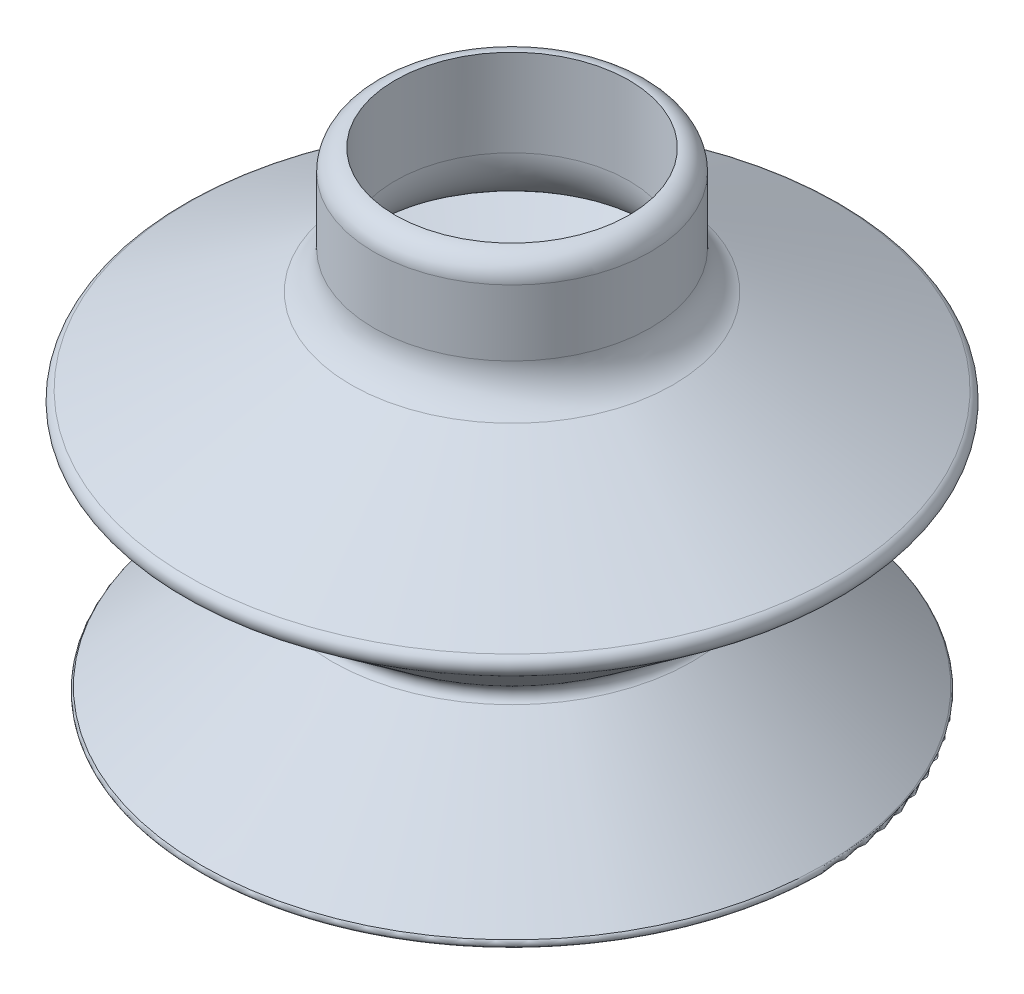
ISO-10303-21;
HEADER;
FILE_DESCRIPTION(('STEP AP214'),'2;1');
FILE_NAME('part.step','',(''),(''),'','','');
FILE_SCHEMA(('AUTOMOTIVE_DESIGN { 1 0 10303 214 1 1 1 1 }'));
ENDSEC;
DATA;
#1=APPLICATION_CONTEXT('core data for automotive mechanical design processes');
#2=APPLICATION_PROTOCOL_DEFINITION('international standard','automotive_design',2000,#1);
#3=PRODUCT_CONTEXT('',#1,'mechanical');
#4=PRODUCT('Part','Part','',(#3));
#5=PRODUCT_RELATED_PRODUCT_CATEGORY('part','',(#4));
#6=PRODUCT_DEFINITION_FORMATION('','',#4);
#7=PRODUCT_DEFINITION_CONTEXT('part definition',#1,'design');
#8=PRODUCT_DEFINITION('design','',#6,#7);
#9=PRODUCT_DEFINITION_SHAPE('','',#8);
#10=(LENGTH_UNIT() NAMED_UNIT(*) SI_UNIT(.MILLI.,.METRE.));
#11=(NAMED_UNIT(*) PLANE_ANGLE_UNIT() SI_UNIT($,.RADIAN.));
#12=(NAMED_UNIT(*) SI_UNIT($,.STERADIAN.) SOLID_ANGLE_UNIT());
#13=UNCERTAINTY_MEASURE_WITH_UNIT(LENGTH_MEASURE(1.E-05),#10,'distance_accuracy_value','');
#14=(GEOMETRIC_REPRESENTATION_CONTEXT(3) GLOBAL_UNCERTAINTY_ASSIGNED_CONTEXT((#13)) GLOBAL_UNIT_ASSIGNED_CONTEXT((#10,
#11,#12)) REPRESENTATION_CONTEXT('',''));
#15=CARTESIAN_POINT('',(0.,0.,0.));
#16=DIRECTION('',(0.,0.,1.));
#17=DIRECTION('',(1.,0.,0.));
#18=AXIS2_PLACEMENT_3D('',#15,#16,#17);
#19=CARTESIAN_POINT('',(15.,0.,0.));
#20=DIRECTION('',(0.,-1.,0.));
#21=DIRECTION('',(0.,0.,-1.));
#22=AXIS2_PLACEMENT_3D('',#19,#20,#21);
#23=PLANE('',#22);
#24=CARTESIAN_POINT('',(0.,0.,0.));
#25=DIRECTION('',(0.,-1.,0.));
#26=DIRECTION('',(0.,0.,-1.));
#27=AXIS2_PLACEMENT_3D('',#24,#25,#26);
#28=CIRCLE('',#27,13.5373940723609);
#29=CARTESIAN_POINT('',(0.,0.,-13.5373940723609));
#30=VERTEX_POINT('',#29);
#31=EDGE_CURVE('E53',#30,#30,#28,.F.);
#32=ORIENTED_EDGE('',*,*,#31,.T.);
#33=EDGE_LOOP('',(#32));
#34=FACE_BOUND('',#33,.T.);
#35=CARTESIAN_POINT('',(0.,0.,0.));
#36=DIRECTION('',(0.,-1.,0.));
#37=DIRECTION('',(0.,0.,-1.));
#38=AXIS2_PLACEMENT_3D('',#35,#36,#37);
#39=CIRCLE('',#38,14.4593485180902);
#40=CARTESIAN_POINT('',(0.,0.,-14.4593485180902));
#41=VERTEX_POINT('',#40);
#42=EDGE_CURVE('E57',#41,#41,#39,.T.);
#43=ORIENTED_EDGE('',*,*,#42,.T.);
#44=EDGE_LOOP('',(#43));
#45=FACE_BOUND('',#44,.T.);
#46=ADVANCED_FACE('F46',(#34,#45),#23,.T.);
#47=CARTESIAN_POINT('',(0.,0.,0.));
#48=DIRECTION('',(0.,-1.,0.));
#49=DIRECTION('',(0.,0.,-1.));
#50=AXIS2_PLACEMENT_3D('',#47,#48,#49);
#51=CONICAL_SURFACE('',#50,15.,0.862170054667226);
#52=CARTESIAN_POINT('',(0.,0.351851320473058,0.));
#53=DIRECTION('',(0.,1.,0.));
#54=DIRECTION('',(0.,0.,1.));
#55=AXIS2_PLACEMENT_3D('',#52,#53,#54);
#56=CIRCLE('',#55,14.5895067927814);
#57=CARTESIAN_POINT('',(0.,0.351851320473058,14.5895067927814));
#58=VERTEX_POINT('',#57);
#59=EDGE_CURVE('E11',#58,#58,#56,.T.);
#60=ORIENTED_EDGE('',*,*,#59,.T.);
#61=EDGE_LOOP('',(#60));
#62=FACE_BOUND('',#61,.T.);
#63=CARTESIAN_POINT('',(0.,5.59884139672114,0.));
#64=DIRECTION('',(0.,-1.,0.));
#65=DIRECTION('',(0.,0.,-1.));
#66=AXIS2_PLACEMENT_3D('',#63,#64,#65);
#67=CIRCLE('',#66,8.468018370492);
#68=CARTESIAN_POINT('',(0.,5.59884139672114,-8.468018370492));
#69=VERTEX_POINT('',#68);
#70=EDGE_CURVE('E69',#69,#69,#67,.T.);
#71=ORIENTED_EDGE('',*,*,#70,.T.);
#72=EDGE_LOOP('',(#71));
#73=FACE_BOUND('',#72,.T.);
#74=ADVANCED_FACE('F149',(#62,#73),#51,.T.);
#75=CARTESIAN_POINT('',(0.,5.97846969790379,0.));
#76=DIRECTION('',(0.,-1.,0.));
#77=DIRECTION('',(0.,0.,-1.));
#78=AXIS2_PLACEMENT_3D('',#75,#76,#77);
#79=TOROIDAL_SURFACE('',#78,8.79341405721999,0.5);
#80=CARTESIAN_POINT('',(0.,6.37518636989395,0.));
#81=DIRECTION('',(0.,-1.,0.));
#82=DIRECTION('',(0.,0.,-1.));
#83=AXIS2_PLACEMENT_3D('',#80,#81,#82);
#84=CIRCLE('',#83,8.48908548122842);
#85=CARTESIAN_POINT('',(0.,6.37518636989395,-8.48908548122842));
#86=VERTEX_POINT('',#85);
#87=EDGE_CURVE('E72',#86,#86,#84,.T.);
#88=ORIENTED_EDGE('',*,*,#87,.T.);
#89=EDGE_LOOP('',(#88));
#90=FACE_BOUND('',#89,.T.);
#91=ORIENTED_EDGE('',*,*,#70,.F.);
#92=EDGE_LOOP('',(#91));
#93=FACE_BOUND('',#92,.T.);
#94=ADVANCED_FACE('F143',(#90,#93),#79,.F.);
#95=CARTESIAN_POINT('',(0.,6.37518636989395,0.));
#96=DIRECTION('',(0.,1.,0.));
#97=DIRECTION('',(0.,0.,1.));
#98=AXIS2_PLACEMENT_3D('',#95,#96,#97);
#99=CONICAL_SURFACE('',#98,8.48908548122842,0.916429288984061);
#100=CARTESIAN_POINT('',(0.,11.6032833280098,0.));
#101=DIRECTION('',(0.,-1.,0.));
#102=DIRECTION('',(0.,0.,-1.));
#103=AXIS2_PLACEMENT_3D('',#100,#101,#102);
#104=CIRCLE('',#103,15.3043285759916);
#105=CARTESIAN_POINT('',(0.,11.6032833280098,-15.3043285759916));
#106=VERTEX_POINT('',#105);
#107=EDGE_CURVE('E75',#106,#106,#104,.T.);
#108=ORIENTED_EDGE('',*,*,#107,.T.);
#109=EDGE_LOOP('',(#108));
#110=FACE_BOUND('',#109,.T.);
#111=ORIENTED_EDGE('',*,*,#87,.F.);
#112=EDGE_LOOP('',(#111));
#113=FACE_BOUND('',#112,.T.);
#114=ADVANCED_FACE('F137',(#110,#113),#99,.T.);
#115=CARTESIAN_POINT('',(0.,12.,0.));
#116=DIRECTION('',(0.,-1.,0.));
#117=DIRECTION('',(0.,0.,-1.));
#118=AXIS2_PLACEMENT_3D('',#115,#116,#117);
#119=TOROIDAL_SURFACE('',#118,15.,0.499999999999998);
#120=CARTESIAN_POINT('',(0.,12.443475068559,0.));
#121=DIRECTION('',(0.,-1.,0.));
#122=DIRECTION('',(0.,0.,-1.));
#123=AXIS2_PLACEMENT_3D('',#120,#121,#122);
#124=CIRCLE('',#123,15.2309325952884);
#125=CARTESIAN_POINT('',(0.,12.443475068559,-15.2309325952884));
#126=VERTEX_POINT('',#125);
#127=EDGE_CURVE('E78',#126,#126,#124,.T.);
#128=ORIENTED_EDGE('',*,*,#127,.T.);
#129=EDGE_LOOP('',(#128));
#130=FACE_BOUND('',#129,.T.);
#131=ORIENTED_EDGE('',*,*,#107,.F.);
#132=EDGE_LOOP('',(#131));
#133=FACE_BOUND('',#132,.T.);
#134=ADVANCED_FACE('F131',(#130,#133),#119,.T.);
#135=CARTESIAN_POINT('',(0.,12.443475068559,0.));
#136=DIRECTION('',(0.,-1.,0.));
#137=DIRECTION('',(0.,0.,-1.));
#138=AXIS2_PLACEMENT_3D('',#135,#136,#137);
#139=CONICAL_SURFACE('',#138,15.2309325952884,1.09069935080942);
#140=CARTESIAN_POINT('',(0.,16.4295191836239,0.));
#141=DIRECTION('',(0.,-1.,0.));
#142=DIRECTION('',(0.,0.,-1.));
#143=AXIS2_PLACEMENT_3D('',#140,#141,#142);
#144=CIRCLE('',#143,7.57626961884654);
#145=CARTESIAN_POINT('',(0.,16.4295191836239,-7.57626961884654));
#146=VERTEX_POINT('',#145);
#147=EDGE_CURVE('E81',#146,#146,#144,.T.);
#148=ORIENTED_EDGE('',*,*,#147,.T.);
#149=EDGE_LOOP('',(#148));
#150=FACE_BOUND('',#149,.T.);
#151=ORIENTED_EDGE('',*,*,#127,.F.);
#152=EDGE_LOOP('',(#151));
#153=FACE_BOUND('',#152,.T.);
#154=ADVANCED_FACE('F125',(#150,#153),#139,.T.);
#155=CARTESIAN_POINT('',(0.,18.2034194578597,0.));
#156=DIRECTION('',(0.,-1.,0.));
#157=DIRECTION('',(0.,0.,-1.));
#158=AXIS2_PLACEMENT_3D('',#155,#156,#157);
#159=TOROIDAL_SURFACE('',#158,8.5,2.);
#160=CARTESIAN_POINT('',(0.,18.2034194578597,0.));
#161=DIRECTION('',(0.,-1.,0.));
#162=DIRECTION('',(0.,0.,-1.));
#163=AXIS2_PLACEMENT_3D('',#160,#161,#162);
#164=CIRCLE('',#163,6.5);
#165=CARTESIAN_POINT('',(0.,18.2034194578597,-6.5));
#166=VERTEX_POINT('',#165);
#167=EDGE_CURVE('E84',#166,#166,#164,.T.);
#168=ORIENTED_EDGE('',*,*,#167,.T.);
#169=EDGE_LOOP('',(#168));
#170=FACE_BOUND('',#169,.T.);
#171=ORIENTED_EDGE('',*,*,#147,.F.);
#172=EDGE_LOOP('',(#171));
#173=FACE_BOUND('',#172,.T.);
#174=ADVANCED_FACE('F119',(#170,#173),#159,.F.);
#175=CARTESIAN_POINT('',(0.,0.,0.));
#176=DIRECTION('',(0.,-1.,0.));
#177=DIRECTION('',(0.,0.,-1.));
#178=AXIS2_PLACEMENT_3D('',#175,#176,#177);
#179=CYLINDRICAL_SURFACE('',#178,6.5);
#180=CARTESIAN_POINT('',(0.,21.3,0.));
#181=DIRECTION('',(0.,1.,0.));
#182=DIRECTION('',(0.,0.,1.));
#183=AXIS2_PLACEMENT_3D('',#180,#181,#182);
#184=CIRCLE('',#183,6.5);
#185=CARTESIAN_POINT('',(0.,21.3,6.5));
#186=VERTEX_POINT('',#185);
#187=EDGE_CURVE('E66',#186,#186,#184,.F.);
#188=ORIENTED_EDGE('',*,*,#187,.T.);
#189=EDGE_LOOP('',(#188));
#190=FACE_BOUND('',#189,.T.);
#191=ORIENTED_EDGE('',*,*,#167,.F.);
#192=EDGE_LOOP('',(#191));
#193=FACE_BOUND('',#192,.T.);
#194=ADVANCED_FACE('F116',(#190,#193),#179,.T.);
#195=CARTESIAN_POINT('',(0.,0.,0.));
#196=DIRECTION('',(0.,-1.,0.));
#197=DIRECTION('',(0.,0.,-1.));
#198=AXIS2_PLACEMENT_3D('',#195,#196,#197);
#199=CYLINDRICAL_SURFACE('',#198,5.5);
#200=CARTESIAN_POINT('',(0.,18.2034194578597,0.));
#201=DIRECTION('',(0.,-1.,0.));
#202=DIRECTION('',(0.,0.,-1.));
#203=AXIS2_PLACEMENT_3D('',#200,#201,#202);
#204=CIRCLE('',#203,5.5);
#205=CARTESIAN_POINT('',(0.,18.2034194578597,-5.5));
#206=VERTEX_POINT('',#205);
#207=EDGE_CURVE('E87',#206,#206,#204,.T.);
#208=ORIENTED_EDGE('',*,*,#207,.T.);
#209=EDGE_LOOP('',(#208));
#210=FACE_BOUND('',#209,.T.);
#211=CARTESIAN_POINT('',(0.,22.3,0.));
#212=DIRECTION('',(0.,1.,0.));
#213=DIRECTION('',(0.,0.,1.));
#214=AXIS2_PLACEMENT_3D('',#211,#212,#213);
#215=CIRCLE('',#214,5.5);
#216=CARTESIAN_POINT('',(0.,22.3,5.5));
#217=VERTEX_POINT('',#216);
#218=EDGE_CURVE('E102',#217,#217,#215,.T.);
#219=ORIENTED_EDGE('',*,*,#218,.T.);
#220=EDGE_LOOP('',(#219));
#221=FACE_BOUND('',#220,.T.);
#222=ADVANCED_FACE('F106',(#210,#221),#199,.F.);
#223=CARTESIAN_POINT('',(0.,18.2034194578597,0.));
#224=DIRECTION('',(0.,-1.,0.));
#225=DIRECTION('',(0.,0.,-1.));
#226=AXIS2_PLACEMENT_3D('',#223,#224,#225);
#227=TOROIDAL_SURFACE('',#226,8.5,3.);
#228=CARTESIAN_POINT('',(0.,15.5425690465059,0.));
#229=DIRECTION('',(0.,-1.,0.));
#230=DIRECTION('',(0.,0.,-1.));
#231=AXIS2_PLACEMENT_3D('',#228,#229,#230);
#232=CIRCLE('',#231,7.11440442826981);
#233=CARTESIAN_POINT('',(0.,15.5425690465059,-7.11440442826981));
#234=VERTEX_POINT('',#233);
#235=EDGE_CURVE('E90',#234,#234,#232,.T.);
#236=ORIENTED_EDGE('',*,*,#235,.T.);
#237=EDGE_LOOP('',(#236));
#238=FACE_BOUND('',#237,.T.);
#239=ORIENTED_EDGE('',*,*,#207,.F.);
#240=EDGE_LOOP('',(#239));
#241=FACE_BOUND('',#240,.T.);
#242=ADVANCED_FACE('F188',(#238,#241),#227,.T.);
#243=CARTESIAN_POINT('',(0.,15.5425690465059,0.));
#244=DIRECTION('',(0.,-1.,0.));
#245=DIRECTION('',(0.,0.,-1.));
#246=AXIS2_PLACEMENT_3D('',#243,#244,#245);
#247=CONICAL_SURFACE('',#246,7.11440442826981,1.09069935080942);
#248=CARTESIAN_POINT('',(0.,11.9190164955515,0.));
#249=DIRECTION('',(0.,-1.,0.));
#250=DIRECTION('',(0.,0.,-1.));
#251=AXIS2_PLACEMENT_3D('',#248,#249,#250);
#252=CIRCLE('',#251,14.0729509857834);
#253=CARTESIAN_POINT('',(0.,11.9190164955515,-14.0729509857834));
#254=VERTEX_POINT('',#253);
#255=EDGE_CURVE('E93',#254,#254,#252,.T.);
#256=ORIENTED_EDGE('',*,*,#255,.T.);
#257=EDGE_LOOP('',(#256));
#258=FACE_BOUND('',#257,.T.);
#259=ORIENTED_EDGE('',*,*,#235,.F.);
#260=EDGE_LOOP('',(#259));
#261=FACE_BOUND('',#260,.T.);
#262=ADVANCED_FACE('F182',(#258,#261),#247,.F.);
#263=CARTESIAN_POINT('',(0.,11.9190164955515,0.));
#264=DIRECTION('',(0.,1.,0.));
#265=DIRECTION('',(0.,0.,1.));
#266=AXIS2_PLACEMENT_3D('',#263,#264,#265);
#267=CONICAL_SURFACE('',#266,14.0729509857834,0.916429288984062);
#268=CARTESIAN_POINT('',(0.,7.16861971387426,0.));
#269=DIRECTION('',(0.,-1.,0.));
#270=DIRECTION('',(0.,0.,-1.));
#271=AXIS2_PLACEMENT_3D('',#268,#269,#270);
#272=CIRCLE('',#271,7.88042832924529);
#273=CARTESIAN_POINT('',(0.,7.16861971387426,-7.88042832924529));
#274=VERTEX_POINT('',#273);
#275=EDGE_CURVE('E96',#274,#274,#272,.T.);
#276=ORIENTED_EDGE('',*,*,#275,.T.);
#277=EDGE_LOOP('',(#276));
#278=FACE_BOUND('',#277,.T.);
#279=ORIENTED_EDGE('',*,*,#255,.F.);
#280=EDGE_LOOP('',(#279));
#281=FACE_BOUND('',#280,.T.);
#282=ADVANCED_FACE('F176',(#278,#281),#267,.F.);
#283=CARTESIAN_POINT('',(0.,5.97846969790379,0.));
#284=DIRECTION('',(0.,-1.,0.));
#285=DIRECTION('',(0.,0.,-1.));
#286=AXIS2_PLACEMENT_3D('',#283,#284,#285);
#287=TOROIDAL_SURFACE('',#286,8.79341405721999,1.5);
#288=CARTESIAN_POINT('',(0.,4.83958479435585,0.));
#289=DIRECTION('',(0.,-1.,0.));
#290=DIRECTION('',(0.,0.,-1.));
#291=AXIS2_PLACEMENT_3D('',#288,#289,#290);
#292=CIRCLE('',#291,7.81722699703603);
#293=CARTESIAN_POINT('',(0.,4.83958479435585,-7.81722699703603));
#294=VERTEX_POINT('',#293);
#295=EDGE_CURVE('E99',#294,#294,#292,.T.);
#296=ORIENTED_EDGE('',*,*,#295,.T.);
#297=EDGE_LOOP('',(#296));
#298=FACE_BOUND('',#297,.T.);
#299=ORIENTED_EDGE('',*,*,#275,.F.);
#300=EDGE_LOOP('',(#299));
#301=FACE_BOUND('',#300,.T.);
#302=ADVANCED_FACE('F170',(#298,#301),#287,.T.);
#303=CARTESIAN_POINT('',(0.,4.83958479435585,0.));
#304=DIRECTION('',(0.,-1.,0.));
#305=DIRECTION('',(0.,0.,-1.));
#306=AXIS2_PLACEMENT_3D('',#303,#304,#305);
#307=CONICAL_SURFACE('',#306,7.81722699703603,0.862170054667226);
#308=CARTESIAN_POINT('',(0.,0.0481486795269395,0.));
#309=DIRECTION('',(0.,1.,0.));
#310=DIRECTION('',(0.,0.,1.));
#311=AXIS2_PLACEMENT_3D('',#308,#309,#310);
#312=CIRCLE('',#311,13.4072357976698);
#313=CARTESIAN_POINT('',(0.,0.0481486795269395,13.4072357976698));
#314=VERTEX_POINT('',#313);
#315=EDGE_CURVE('E61',#314,#314,#312,.F.);
#316=ORIENTED_EDGE('',*,*,#315,.T.);
#317=EDGE_LOOP('',(#316));
#318=FACE_BOUND('',#317,.T.);
#319=ORIENTED_EDGE('',*,*,#295,.F.);
#320=EDGE_LOOP('',(#319));
#321=FACE_BOUND('',#320,.T.);
#322=ADVANCED_FACE('F112',(#318,#321),#307,.F.);
#323=CARTESIAN_POINT('',(0.,21.3,0.));
#324=DIRECTION('',(0.,1.,0.));
#325=DIRECTION('',(0.,0.,1.));
#326=AXIS2_PLACEMENT_3D('',#323,#324,#325);
#327=TOROIDAL_SURFACE('',#326,5.5,1.);
#328=ORIENTED_EDGE('',*,*,#218,.F.);
#329=EDGE_LOOP('',(#328));
#330=FACE_BOUND('',#329,.T.);
#331=ORIENTED_EDGE('',*,*,#187,.F.);
#332=EDGE_LOOP('',(#331));
#333=FACE_BOUND('',#332,.T.);
#334=ADVANCED_FACE('F108',(#330,#333),#327,.T.);
#335=CARTESIAN_POINT('',(0.,0.2,0.));
#336=DIRECTION('',(0.,-1.,0.));
#337=DIRECTION('',(0.,0.,-1.));
#338=AXIS2_PLACEMENT_3D('',#335,#336,#337);
#339=TOROIDAL_SURFACE('',#338,13.5373940723609,0.2);
#340=ORIENTED_EDGE('',*,*,#31,.F.);
#341=EDGE_LOOP('',(#340));
#342=FACE_BOUND('',#341,.T.);
#343=ORIENTED_EDGE('',*,*,#315,.F.);
#344=EDGE_LOOP('',(#343));
#345=FACE_BOUND('',#344,.T.);
#346=ADVANCED_FACE('F111',(#342,#345),#339,.T.);
#347=CARTESIAN_POINT('',(0.,0.2,0.));
#348=DIRECTION('',(0.,-1.,0.));
#349=DIRECTION('',(0.,0.,-1.));
#350=AXIS2_PLACEMENT_3D('',#347,#348,#349);
#351=TOROIDAL_SURFACE('',#350,14.4593485180902,0.2);
#352=ORIENTED_EDGE('',*,*,#59,.F.);
#353=EDGE_LOOP('',(#352));
#354=FACE_BOUND('',#353,.T.);
#355=ORIENTED_EDGE('',*,*,#42,.F.);
#356=EDGE_LOOP('',(#355));
#357=FACE_BOUND('',#356,.T.);
#358=ADVANCED_FACE('F48',(#354,#357),#351,.T.);
#359=CLOSED_SHELL('',(#46,#74,#94,#114,#134,#154,#174,#194,#222,#242,#262,#282,#302,#322,#334,
#346,#358));
#360=MANIFOLD_SOLID_BREP('B2',#359);
#361=ADVANCED_BREP_SHAPE_REPRESENTATION('',(#18,#360),#14);
#362=SHAPE_DEFINITION_REPRESENTATION(#9,#361);
ENDSEC;
END-ISO-10303-21;
